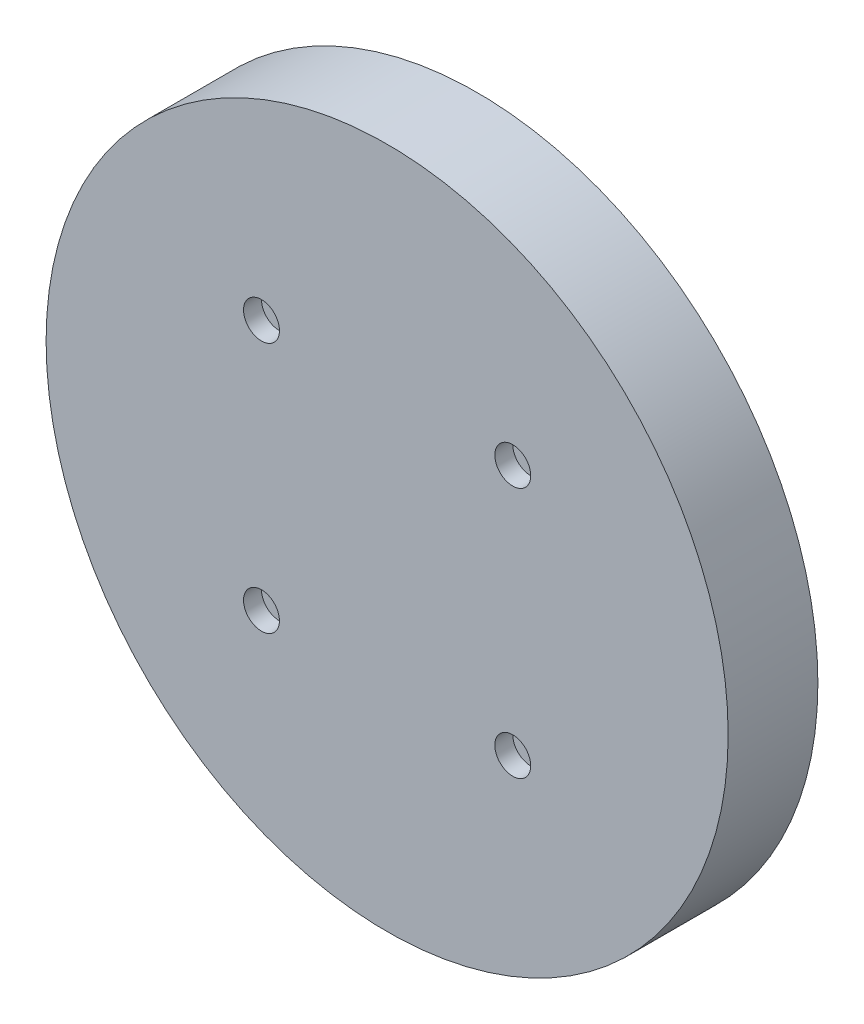
ISO-10303-21;
HEADER;
FILE_DESCRIPTION(('STEP AP214'),'2;1');
FILE_NAME('part.step','',(''),(''),'','','');
FILE_SCHEMA(('AUTOMOTIVE_DESIGN { 1 0 10303 214 1 1 1 1 }'));
ENDSEC;
DATA;
#1=APPLICATION_CONTEXT('core data for automotive mechanical design processes');
#2=APPLICATION_PROTOCOL_DEFINITION('international standard','automotive_design',2000,#1);
#3=PRODUCT_CONTEXT('',#1,'mechanical');
#4=PRODUCT('Part','Part','',(#3));
#5=PRODUCT_RELATED_PRODUCT_CATEGORY('part','',(#4));
#6=PRODUCT_DEFINITION_FORMATION('','',#4);
#7=PRODUCT_DEFINITION_CONTEXT('part definition',#1,'design');
#8=PRODUCT_DEFINITION('design','',#6,#7);
#9=PRODUCT_DEFINITION_SHAPE('','',#8);
#10=(LENGTH_UNIT() NAMED_UNIT(*) SI_UNIT(.MILLI.,.METRE.));
#11=(NAMED_UNIT(*) PLANE_ANGLE_UNIT() SI_UNIT($,.RADIAN.));
#12=(NAMED_UNIT(*) SI_UNIT($,.STERADIAN.) SOLID_ANGLE_UNIT());
#13=UNCERTAINTY_MEASURE_WITH_UNIT(LENGTH_MEASURE(1.E-05),#10,'distance_accuracy_value','');
#14=(GEOMETRIC_REPRESENTATION_CONTEXT(3) GLOBAL_UNCERTAINTY_ASSIGNED_CONTEXT((#13)) GLOBAL_UNIT_ASSIGNED_CONTEXT((#10,
#11,#12)) REPRESENTATION_CONTEXT('',''));
#15=CARTESIAN_POINT('',(0.,0.,0.));
#16=DIRECTION('',(0.,0.,1.));
#17=DIRECTION('',(1.,0.,0.));
#18=AXIS2_PLACEMENT_3D('',#15,#16,#17);
#19=CARTESIAN_POINT('',(0.,0.,5.));
#20=DIRECTION('',(0.,0.,-1.));
#21=DIRECTION('',(-1.,0.,0.));
#22=AXIS2_PLACEMENT_3D('',#19,#20,#21);
#23=CYLINDRICAL_SURFACE('',#22,19.);
#24=CARTESIAN_POINT('',(0.,0.,5.));
#25=DIRECTION('',(0.,0.,1.));
#26=DIRECTION('',(1.,0.,0.));
#27=AXIS2_PLACEMENT_3D('',#24,#25,#26);
#28=CIRCLE('',#27,19.);
#29=CARTESIAN_POINT('',(19.,0.,5.));
#30=VERTEX_POINT('',#29);
#31=EDGE_CURVE('E10',#30,#30,#28,.T.);
#32=ORIENTED_EDGE('',*,*,#31,.F.);
#33=EDGE_LOOP('',(#32));
#34=FACE_BOUND('',#33,.T.);
#35=CARTESIAN_POINT('',(0.,0.,0.));
#36=DIRECTION('',(0.,0.,1.));
#37=DIRECTION('',(1.,0.,0.));
#38=AXIS2_PLACEMENT_3D('',#35,#36,#37);
#39=CIRCLE('',#38,19.);
#40=CARTESIAN_POINT('',(19.,0.,0.));
#41=VERTEX_POINT('',#40);
#42=EDGE_CURVE('E34',#41,#41,#39,.T.);
#43=ORIENTED_EDGE('',*,*,#42,.T.);
#44=EDGE_LOOP('',(#43));
#45=FACE_BOUND('',#44,.T.);
#46=ADVANCED_FACE('F31',(#34,#45),#23,.T.);
#47=CARTESIAN_POINT('',(0.,0.,5.));
#48=DIRECTION('',(0.,0.,1.));
#49=DIRECTION('',(1.,0.,0.));
#50=AXIS2_PLACEMENT_3D('',#47,#48,#49);
#51=PLANE('',#50);
#52=CARTESIAN_POINT('',(-7.00000000000001,-7.,5.));
#53=DIRECTION('',(0.,0.,1.));
#54=DIRECTION('',(-1.,0.,0.));
#55=AXIS2_PLACEMENT_3D('',#52,#53,#54);
#56=CIRCLE('',#55,1.);
#57=CARTESIAN_POINT('',(-8.00000000000001,-7.,5.));
#58=VERTEX_POINT('',#57);
#59=EDGE_CURVE('E61',#58,#58,#56,.T.);
#60=ORIENTED_EDGE('',*,*,#59,.F.);
#61=EDGE_LOOP('',(#60));
#62=FACE_BOUND('',#61,.T.);
#63=CARTESIAN_POINT('',(6.99999999999999,-7.,5.));
#64=DIRECTION('',(0.,0.,1.));
#65=DIRECTION('',(1.,0.,0.));
#66=AXIS2_PLACEMENT_3D('',#63,#64,#65);
#67=CIRCLE('',#66,1.);
#68=CARTESIAN_POINT('',(7.99999999999999,-7.,5.));
#69=VERTEX_POINT('',#68);
#70=EDGE_CURVE('E55',#69,#69,#67,.T.);
#71=ORIENTED_EDGE('',*,*,#70,.F.);
#72=EDGE_LOOP('',(#71));
#73=FACE_BOUND('',#72,.T.);
#74=CARTESIAN_POINT('',(7.,7.,5.));
#75=DIRECTION('',(0.,0.,1.));
#76=DIRECTION('',(-1.,0.,0.));
#77=AXIS2_PLACEMENT_3D('',#74,#75,#76);
#78=CIRCLE('',#77,1.);
#79=CARTESIAN_POINT('',(6.,7.,5.));
#80=VERTEX_POINT('',#79);
#81=EDGE_CURVE('E49',#80,#80,#78,.T.);
#82=ORIENTED_EDGE('',*,*,#81,.F.);
#83=EDGE_LOOP('',(#82));
#84=FACE_BOUND('',#83,.T.);
#85=CARTESIAN_POINT('',(-7.,7.,5.));
#86=DIRECTION('',(0.,0.,1.));
#87=DIRECTION('',(1.,0.,0.));
#88=AXIS2_PLACEMENT_3D('',#85,#86,#87);
#89=CIRCLE('',#88,1.);
#90=CARTESIAN_POINT('',(-6.,7.,5.));
#91=VERTEX_POINT('',#90);
#92=EDGE_CURVE('E43',#91,#91,#89,.T.);
#93=ORIENTED_EDGE('',*,*,#92,.F.);
#94=EDGE_LOOP('',(#93));
#95=FACE_BOUND('',#94,.T.);
#96=ORIENTED_EDGE('',*,*,#31,.T.);
#97=EDGE_LOOP('',(#96));
#98=FACE_BOUND('',#97,.T.);
#99=ADVANCED_FACE('F76',(#62,#73,#84,#95,#98),#51,.T.);
#100=CARTESIAN_POINT('',(0.,0.,0.));
#101=DIRECTION('',(0.,0.,1.));
#102=DIRECTION('',(1.,0.,0.));
#103=AXIS2_PLACEMENT_3D('',#100,#101,#102);
#104=PLANE('',#103);
#105=ORIENTED_EDGE('',*,*,#42,.F.);
#106=EDGE_LOOP('',(#105));
#107=FACE_BOUND('',#106,.T.);
#108=ADVANCED_FACE('F79',(#107),#104,.F.);
#109=CARTESIAN_POINT('',(-7.,7.,4.));
#110=DIRECTION('',(0.,0.,1.));
#111=DIRECTION('',(1.,0.,0.));
#112=AXIS2_PLACEMENT_3D('',#109,#110,#111);
#113=CYLINDRICAL_SURFACE('',#112,1.);
#114=CARTESIAN_POINT('',(-7.,7.,4.));
#115=DIRECTION('',(0.,0.,1.));
#116=DIRECTION('',(1.,0.,0.));
#117=AXIS2_PLACEMENT_3D('',#114,#115,#116);
#118=CIRCLE('',#117,1.);
#119=CARTESIAN_POINT('',(-6.,7.,4.));
#120=VERTEX_POINT('',#119);
#121=EDGE_CURVE('E41',#120,#120,#118,.T.);
#122=ORIENTED_EDGE('',*,*,#121,.F.);
#123=EDGE_LOOP('',(#122));
#124=FACE_BOUND('',#123,.T.);
#125=ORIENTED_EDGE('',*,*,#92,.T.);
#126=EDGE_LOOP('',(#125));
#127=FACE_BOUND('',#126,.T.);
#128=ADVANCED_FACE('F87',(#124,#127),#113,.F.);
#129=CARTESIAN_POINT('',(-7.,7.,4.));
#130=DIRECTION('',(0.,0.,1.));
#131=DIRECTION('',(1.,0.,0.));
#132=AXIS2_PLACEMENT_3D('',#129,#130,#131);
#133=PLANE('',#132);
#134=ORIENTED_EDGE('',*,*,#121,.T.);
#135=EDGE_LOOP('',(#134));
#136=FACE_BOUND('',#135,.T.);
#137=ADVANCED_FACE('F89',(#136),#133,.T.);
#138=CARTESIAN_POINT('',(7.,7.,4.));
#139=DIRECTION('',(0.,0.,1.));
#140=DIRECTION('',(1.,0.,0.));
#141=AXIS2_PLACEMENT_3D('',#138,#139,#140);
#142=CYLINDRICAL_SURFACE('',#141,1.);
#143=CARTESIAN_POINT('',(7.,7.,4.));
#144=DIRECTION('',(0.,0.,1.));
#145=DIRECTION('',(-1.,0.,0.));
#146=AXIS2_PLACEMENT_3D('',#143,#144,#145);
#147=CIRCLE('',#146,1.);
#148=CARTESIAN_POINT('',(6.,7.,4.));
#149=VERTEX_POINT('',#148);
#150=EDGE_CURVE('E46',#149,#149,#147,.T.);
#151=ORIENTED_EDGE('',*,*,#150,.F.);
#152=EDGE_LOOP('',(#151));
#153=FACE_BOUND('',#152,.T.);
#154=ORIENTED_EDGE('',*,*,#81,.T.);
#155=EDGE_LOOP('',(#154));
#156=FACE_BOUND('',#155,.T.);
#157=ADVANCED_FACE('F96',(#153,#156),#142,.F.);
#158=CARTESIAN_POINT('',(7.,7.,4.));
#159=DIRECTION('',(0.,0.,-1.));
#160=DIRECTION('',(-1.,0.,0.));
#161=AXIS2_PLACEMENT_3D('',#158,#159,#160);
#162=PLANE('',#161);
#163=ORIENTED_EDGE('',*,*,#150,.T.);
#164=EDGE_LOOP('',(#163));
#165=FACE_BOUND('',#164,.T.);
#166=ADVANCED_FACE('F136',(#165),#162,.F.);
#167=CARTESIAN_POINT('',(6.99999999999999,-7.,4.));
#168=DIRECTION('',(0.,0.,1.));
#169=DIRECTION('',(1.,0.,0.));
#170=AXIS2_PLACEMENT_3D('',#167,#168,#169);
#171=CYLINDRICAL_SURFACE('',#170,1.);
#172=CARTESIAN_POINT('',(6.99999999999999,-7.,4.));
#173=DIRECTION('',(0.,0.,1.));
#174=DIRECTION('',(1.,0.,0.));
#175=AXIS2_PLACEMENT_3D('',#172,#173,#174);
#176=CIRCLE('',#175,1.);
#177=CARTESIAN_POINT('',(7.99999999999999,-7.,4.));
#178=VERTEX_POINT('',#177);
#179=EDGE_CURVE('E52',#178,#178,#176,.T.);
#180=ORIENTED_EDGE('',*,*,#179,.F.);
#181=EDGE_LOOP('',(#180));
#182=FACE_BOUND('',#181,.T.);
#183=ORIENTED_EDGE('',*,*,#70,.T.);
#184=EDGE_LOOP('',(#183));
#185=FACE_BOUND('',#184,.T.);
#186=ADVANCED_FACE('F145',(#182,#185),#171,.F.);
#187=CARTESIAN_POINT('',(6.99999999999999,-7.,4.));
#188=DIRECTION('',(0.,0.,1.));
#189=DIRECTION('',(1.,0.,0.));
#190=AXIS2_PLACEMENT_3D('',#187,#188,#189);
#191=PLANE('',#190);
#192=ORIENTED_EDGE('',*,*,#179,.T.);
#193=EDGE_LOOP('',(#192));
#194=FACE_BOUND('',#193,.T.);
#195=ADVANCED_FACE('F72',(#194),#191,.T.);
#196=CARTESIAN_POINT('',(-7.00000000000001,-7.,4.));
#197=DIRECTION('',(0.,0.,1.));
#198=DIRECTION('',(1.,0.,0.));
#199=AXIS2_PLACEMENT_3D('',#196,#197,#198);
#200=CYLINDRICAL_SURFACE('',#199,1.);
#201=CARTESIAN_POINT('',(-7.00000000000001,-7.,4.));
#202=DIRECTION('',(0.,0.,1.));
#203=DIRECTION('',(-1.,0.,0.));
#204=AXIS2_PLACEMENT_3D('',#201,#202,#203);
#205=CIRCLE('',#204,1.);
#206=CARTESIAN_POINT('',(-8.00000000000001,-7.,4.));
#207=VERTEX_POINT('',#206);
#208=EDGE_CURVE('E58',#207,#207,#205,.T.);
#209=ORIENTED_EDGE('',*,*,#208,.F.);
#210=EDGE_LOOP('',(#209));
#211=FACE_BOUND('',#210,.T.);
#212=ORIENTED_EDGE('',*,*,#59,.T.);
#213=EDGE_LOOP('',(#212));
#214=FACE_BOUND('',#213,.T.);
#215=ADVANCED_FACE('F69',(#211,#214),#200,.F.);
#216=CARTESIAN_POINT('',(-7.00000000000001,-7.,4.));
#217=DIRECTION('',(0.,0.,-1.));
#218=DIRECTION('',(-1.,0.,0.));
#219=AXIS2_PLACEMENT_3D('',#216,#217,#218);
#220=PLANE('',#219);
#221=ORIENTED_EDGE('',*,*,#208,.T.);
#222=EDGE_LOOP('',(#221));
#223=FACE_BOUND('',#222,.T.);
#224=ADVANCED_FACE('F67',(#223),#220,.F.);
#225=CLOSED_SHELL('',(#46,#99,#108,#128,#137,#157,#166,#186,#195,#215,#224));
#226=MANIFOLD_SOLID_BREP('B2',#225);
#227=ADVANCED_BREP_SHAPE_REPRESENTATION('',(#18,#226),#14);
#228=SHAPE_DEFINITION_REPRESENTATION(#9,#227);
ENDSEC;
END-ISO-10303-21;
